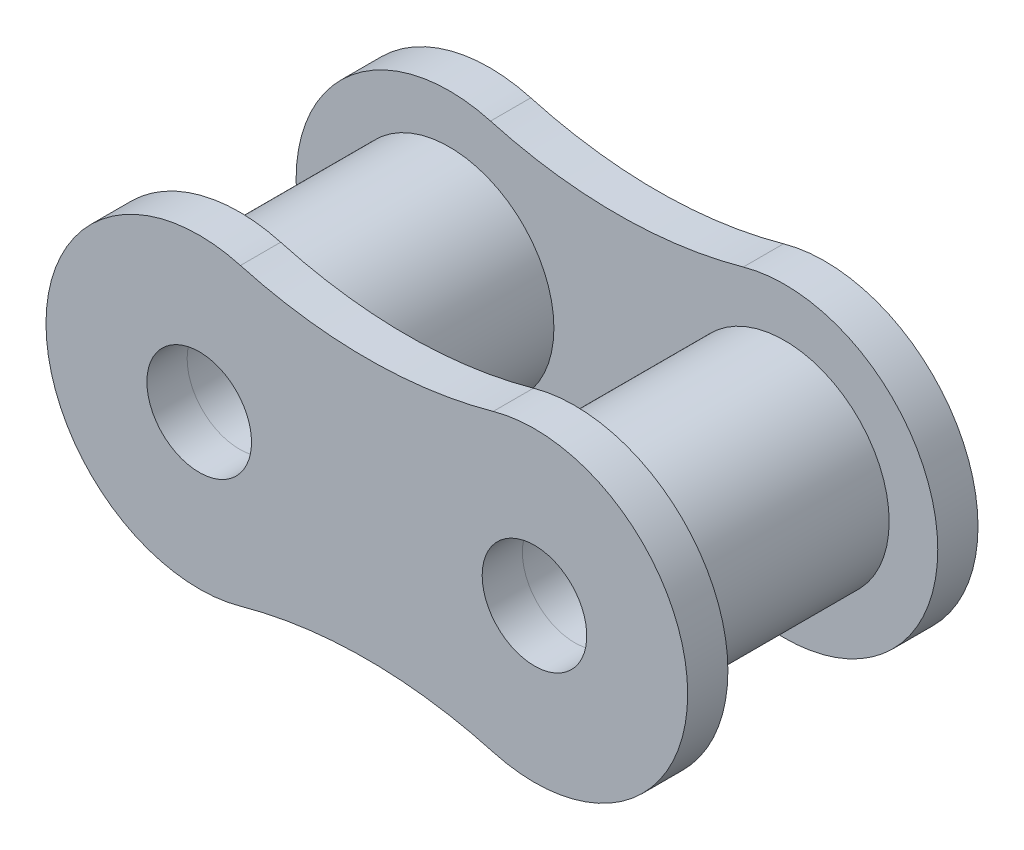
ISO-10303-21;
HEADER;
FILE_DESCRIPTION(('STEP AP214'),'2;1');
FILE_NAME('part.step','',(''),(''),'','','');
FILE_SCHEMA(('AUTOMOTIVE_DESIGN { 1 0 10303 214 1 1 1 1 }'));
ENDSEC;
DATA;
#1=APPLICATION_CONTEXT('core data for automotive mechanical design processes');
#2=APPLICATION_PROTOCOL_DEFINITION('international standard','automotive_design',2000,#1);
#3=PRODUCT_CONTEXT('',#1,'mechanical');
#4=PRODUCT('Part','Part','',(#3));
#5=PRODUCT_RELATED_PRODUCT_CATEGORY('part','',(#4));
#6=PRODUCT_DEFINITION_FORMATION('','',#4);
#7=PRODUCT_DEFINITION_CONTEXT('part definition',#1,'design');
#8=PRODUCT_DEFINITION('design','',#6,#7);
#9=PRODUCT_DEFINITION_SHAPE('','',#8);
#10=(LENGTH_UNIT() NAMED_UNIT(*) SI_UNIT(.MILLI.,.METRE.));
#11=(NAMED_UNIT(*) PLANE_ANGLE_UNIT() SI_UNIT($,.RADIAN.));
#12=(NAMED_UNIT(*) SI_UNIT($,.STERADIAN.) SOLID_ANGLE_UNIT());
#13=UNCERTAINTY_MEASURE_WITH_UNIT(LENGTH_MEASURE(1.E-05),#10,'distance_accuracy_value','');
#14=(GEOMETRIC_REPRESENTATION_CONTEXT(3) GLOBAL_UNCERTAINTY_ASSIGNED_CONTEXT((#13)) GLOBAL_UNIT_ASSIGNED_CONTEXT((#10,
#11,#12)) REPRESENTATION_CONTEXT('',''));
#15=CARTESIAN_POINT('',(0.,0.,0.));
#16=DIRECTION('',(0.,0.,1.));
#17=DIRECTION('',(1.,0.,0.));
#18=AXIS2_PLACEMENT_3D('',#15,#16,#17);
#19=CARTESIAN_POINT('',(3.175,11.3614930643691,5.4991));
#20=DIRECTION('',(0.,0.,1.));
#21=DIRECTION('',(1.,0.,0.));
#22=AXIS2_PLACEMENT_3D('',#19,#20,#21);
#23=PLANE('',#22);
#24=CARTESIAN_POINT('',(0.,-22.7229861287381,5.4991));
#25=DIRECTION('',(0.,0.,-1.));
#26=DIRECTION('',(-1.,0.,0.));
#27=AXIS2_PLACEMENT_3D('',#24,#25,#26);
#28=CIRCLE('',#27,17.7896711287381);
#29=CARTESIAN_POINT('',(-4.78793189259471,-5.58974046247473,5.4991));
#30=VERTEX_POINT('',#29);
#31=CARTESIAN_POINT('',(4.78793189259474,-5.58974046247474,5.4991));
#32=VERTEX_POINT('',#31);
#33=EDGE_CURVE('E82',#30,#32,#28,.T.);
#34=ORIENTED_EDGE('',*,*,#33,.T.);
#35=CARTESIAN_POINT('',(6.35,0.,5.4991));
#36=DIRECTION('',(0.,0.,-1.));
#37=DIRECTION('',(-1.,0.,0.));
#38=AXIS2_PLACEMENT_3D('',#35,#36,#37);
#39=CIRCLE('',#38,5.8039);
#40=CARTESIAN_POINT('',(4.78793189259472,5.58974046247474,5.4991));
#41=VERTEX_POINT('',#40);
#42=EDGE_CURVE('E103',#41,#32,#39,.T.);
#43=ORIENTED_EDGE('',*,*,#42,.F.);
#44=CARTESIAN_POINT('',(0.,22.7229861287381,5.4991));
#45=DIRECTION('',(0.,0.,-1.));
#46=DIRECTION('',(-1.,0.,0.));
#47=AXIS2_PLACEMENT_3D('',#44,#45,#46);
#48=CIRCLE('',#47,17.7896711287381);
#49=CARTESIAN_POINT('',(-4.78793189259462,5.58974046247471,5.4991));
#50=VERTEX_POINT('',#49);
#51=EDGE_CURVE('E85',#41,#50,#48,.T.);
#52=ORIENTED_EDGE('',*,*,#51,.T.);
#53=CARTESIAN_POINT('',(-6.35,0.,5.4991));
#54=DIRECTION('',(0.,0.,-1.));
#55=DIRECTION('',(-1.,0.,0.));
#56=AXIS2_PLACEMENT_3D('',#53,#54,#55);
#57=CIRCLE('',#56,5.8039);
#58=EDGE_CURVE('E19',#30,#50,#57,.T.);
#59=ORIENTED_EDGE('',*,*,#58,.F.);
#60=EDGE_LOOP('',(#34,#43,#52,#59));
#61=FACE_BOUND('',#60,.T.);
#62=CARTESIAN_POINT('',(-6.35,0.,5.4991));
#63=DIRECTION('',(0.,0.,-1.));
#64=DIRECTION('',(-1.,0.,0.));
#65=AXIS2_PLACEMENT_3D('',#62,#63,#64);
#66=CIRCLE('',#65,1.9812);
#67=CARTESIAN_POINT('',(-8.3312,0.,5.4991));
#68=VERTEX_POINT('',#67);
#69=EDGE_CURVE('E114',#68,#68,#66,.T.);
#70=ORIENTED_EDGE('',*,*,#69,.T.);
#71=EDGE_LOOP('',(#70));
#72=FACE_BOUND('',#71,.T.);
#73=CARTESIAN_POINT('',(6.35,0.,5.4991));
#74=DIRECTION('',(0.,0.,-1.));
#75=DIRECTION('',(-1.,0.,0.));
#76=AXIS2_PLACEMENT_3D('',#73,#74,#75);
#77=CIRCLE('',#76,1.9812);
#78=CARTESIAN_POINT('',(4.3688,0.,5.4991));
#79=VERTEX_POINT('',#78);
#80=EDGE_CURVE('E118',#79,#79,#77,.T.);
#81=ORIENTED_EDGE('',*,*,#80,.T.);
#82=EDGE_LOOP('',(#81));
#83=FACE_BOUND('',#82,.T.);
#84=ADVANCED_FACE('F16',(#61,#72,#83),#23,.T.);
#85=CARTESIAN_POINT('',(-6.35,0.,5.4991));
#86=DIRECTION('',(0.,0.,-1.));
#87=DIRECTION('',(-1.,0.,0.));
#88=AXIS2_PLACEMENT_3D('',#85,#86,#87);
#89=CYLINDRICAL_SURFACE('',#88,5.8039);
#90=CARTESIAN_POINT('',(-6.35,0.,3.9751));
#91=DIRECTION('',(0.,0.,-1.));
#92=DIRECTION('',(-1.,0.,0.));
#93=AXIS2_PLACEMENT_3D('',#90,#91,#92);
#94=CIRCLE('',#93,5.8039);
#95=CARTESIAN_POINT('',(-4.78793189259462,5.58974046247471,3.9751));
#96=VERTEX_POINT('',#95);
#97=CARTESIAN_POINT('',(-4.78793189259471,-5.58974046247473,3.9751));
#98=VERTEX_POINT('',#97);
#99=EDGE_CURVE('E93',#96,#98,#94,.F.);
#100=ORIENTED_EDGE('',*,*,#99,.T.);
#101=DIRECTION('',(0.,0.,-1.));
#102=VECTOR('',#101,1.);
#103=CARTESIAN_POINT('',(-4.78793189259471,-5.58974046247473,5.4991));
#104=LINE('',#103,#102);
#105=EDGE_CURVE('E89',#98,#30,#104,.F.);
#106=ORIENTED_EDGE('',*,*,#105,.T.);
#107=ORIENTED_EDGE('',*,*,#58,.T.);
#108=DIRECTION('',(0.,0.,-1.));
#109=VECTOR('',#108,1.);
#110=CARTESIAN_POINT('',(-4.78793189259454,5.58974046247469,5.4991));
#111=LINE('',#110,#109);
#112=EDGE_CURVE('E112',#50,#96,#111,.T.);
#113=ORIENTED_EDGE('',*,*,#112,.T.);
#114=EDGE_LOOP('',(#100,#106,#107,#113));
#115=FACE_BOUND('',#114,.T.);
#116=ADVANCED_FACE('F91',(#115),#89,.T.);
#117=CARTESIAN_POINT('',(0.,-22.7229861287381,5.4991));
#118=DIRECTION('',(0.,0.,-1.));
#119=DIRECTION('',(-1.,0.,0.));
#120=AXIS2_PLACEMENT_3D('',#117,#118,#119);
#121=CYLINDRICAL_SURFACE('',#120,17.7896711287381);
#122=DIRECTION('',(0.,0.,-1.));
#123=VECTOR('',#122,1.);
#124=CARTESIAN_POINT('',(4.78793189259476,-5.58974046247475,5.4991));
#125=LINE('',#124,#123);
#126=CARTESIAN_POINT('',(4.78793189259474,-5.58974046247474,3.9751));
#127=VERTEX_POINT('',#126);
#128=EDGE_CURVE('E100',#32,#127,#125,.T.);
#129=ORIENTED_EDGE('',*,*,#128,.F.);
#130=ORIENTED_EDGE('',*,*,#33,.F.);
#131=ORIENTED_EDGE('',*,*,#105,.F.);
#132=CARTESIAN_POINT('',(0.,-22.7229861287381,3.9751));
#133=DIRECTION('',(0.,0.,-1.));
#134=DIRECTION('',(-1.,0.,0.));
#135=AXIS2_PLACEMENT_3D('',#132,#133,#134);
#136=CIRCLE('',#135,17.7896711287381);
#137=EDGE_CURVE('E124',#98,#127,#136,.T.);
#138=ORIENTED_EDGE('',*,*,#137,.T.);
#139=EDGE_LOOP('',(#129,#130,#131,#138));
#140=FACE_BOUND('',#139,.T.);
#141=ADVANCED_FACE('F98',(#140),#121,.F.);
#142=CARTESIAN_POINT('',(6.35,0.,5.4991));
#143=DIRECTION('',(0.,0.,-1.));
#144=DIRECTION('',(-1.,0.,0.));
#145=AXIS2_PLACEMENT_3D('',#142,#143,#144);
#146=CYLINDRICAL_SURFACE('',#145,5.8039);
#147=ORIENTED_EDGE('',*,*,#42,.T.);
#148=ORIENTED_EDGE('',*,*,#128,.T.);
#149=CARTESIAN_POINT('',(6.35,0.,3.9751));
#150=DIRECTION('',(0.,0.,-1.));
#151=DIRECTION('',(-1.,0.,0.));
#152=AXIS2_PLACEMENT_3D('',#149,#150,#151);
#153=CIRCLE('',#152,5.8039);
#154=CARTESIAN_POINT('',(4.78793189259472,5.58974046247474,3.9751));
#155=VERTEX_POINT('',#154);
#156=EDGE_CURVE('E127',#127,#155,#153,.F.);
#157=ORIENTED_EDGE('',*,*,#156,.T.);
#158=DIRECTION('',(0.,0.,-1.));
#159=VECTOR('',#158,1.);
#160=CARTESIAN_POINT('',(4.78793189259472,5.58974046247474,5.4991));
#161=LINE('',#160,#159);
#162=EDGE_CURVE('E113',#155,#41,#161,.F.);
#163=ORIENTED_EDGE('',*,*,#162,.T.);
#164=EDGE_LOOP('',(#147,#148,#157,#163));
#165=FACE_BOUND('',#164,.T.);
#166=ADVANCED_FACE('F452',(#165),#146,.T.);
#167=CARTESIAN_POINT('',(0.,22.7229861287381,5.4991));
#168=DIRECTION('',(0.,0.,-1.));
#169=DIRECTION('',(-1.,0.,0.));
#170=AXIS2_PLACEMENT_3D('',#167,#168,#169);
#171=CYLINDRICAL_SURFACE('',#170,17.7896711287381);
#172=ORIENTED_EDGE('',*,*,#112,.F.);
#173=ORIENTED_EDGE('',*,*,#51,.F.);
#174=ORIENTED_EDGE('',*,*,#162,.F.);
#175=CARTESIAN_POINT('',(0.,22.7229861287381,3.9751));
#176=DIRECTION('',(0.,0.,-1.));
#177=DIRECTION('',(-1.,0.,0.));
#178=AXIS2_PLACEMENT_3D('',#175,#176,#177);
#179=CIRCLE('',#178,17.7896711287381);
#180=EDGE_CURVE('E130',#155,#96,#179,.T.);
#181=ORIENTED_EDGE('',*,*,#180,.T.);
#182=EDGE_LOOP('',(#172,#173,#174,#181));
#183=FACE_BOUND('',#182,.T.);
#184=ADVANCED_FACE('F442',(#183),#171,.F.);
#185=CARTESIAN_POINT('',(-6.35,0.,5.4991));
#186=DIRECTION('',(0.,0.,-1.));
#187=DIRECTION('',(-1.,0.,0.));
#188=AXIS2_PLACEMENT_3D('',#185,#186,#187);
#189=CYLINDRICAL_SURFACE('',#188,1.9812);
#190=ORIENTED_EDGE('',*,*,#69,.F.);
#191=EDGE_LOOP('',(#190));
#192=FACE_BOUND('',#191,.T.);
#193=CARTESIAN_POINT('',(-6.35,0.,3.9751));
#194=DIRECTION('',(0.,0.,-1.));
#195=DIRECTION('',(-1.,0.,0.));
#196=AXIS2_PLACEMENT_3D('',#193,#194,#195);
#197=CIRCLE('',#196,1.9812);
#198=CARTESIAN_POINT('',(-8.3312,0.,3.9751));
#199=VERTEX_POINT('',#198);
#200=EDGE_CURVE('E134',#199,#199,#197,.T.);
#201=ORIENTED_EDGE('',*,*,#200,.T.);
#202=EDGE_LOOP('',(#201));
#203=FACE_BOUND('',#202,.T.);
#204=ADVANCED_FACE('F432',(#192,#203),#189,.F.);
#205=CARTESIAN_POINT('',(6.35,0.,8.2042));
#206=DIRECTION('',(0.,0.,-1.));
#207=DIRECTION('',(-1.,0.,0.));
#208=AXIS2_PLACEMENT_3D('',#205,#206,#207);
#209=CYLINDRICAL_SURFACE('',#208,1.9812);
#210=ORIENTED_EDGE('',*,*,#80,.F.);
#211=EDGE_LOOP('',(#210));
#212=FACE_BOUND('',#211,.T.);
#213=CARTESIAN_POINT('',(6.35,0.,3.9751));
#214=DIRECTION('',(0.,0.,-1.));
#215=DIRECTION('',(-1.,0.,0.));
#216=AXIS2_PLACEMENT_3D('',#213,#214,#215);
#217=CIRCLE('',#216,1.9812);
#218=CARTESIAN_POINT('',(4.3688,0.,3.9751));
#219=VERTEX_POINT('',#218);
#220=EDGE_CURVE('E138',#219,#219,#217,.T.);
#221=ORIENTED_EDGE('',*,*,#220,.T.);
#222=EDGE_LOOP('',(#221));
#223=FACE_BOUND('',#222,.T.);
#224=ADVANCED_FACE('F422',(#212,#223),#209,.F.);
#225=CARTESIAN_POINT('',(3.175,11.3614930643691,3.9751));
#226=DIRECTION('',(0.,0.,1.));
#227=DIRECTION('',(1.,0.,0.));
#228=AXIS2_PLACEMENT_3D('',#225,#226,#227);
#229=PLANE('',#228);
#230=CARTESIAN_POINT('',(6.35,0.,3.9751));
#231=DIRECTION('',(0.,0.,-1.));
#232=DIRECTION('',(-1.,0.,0.));
#233=AXIS2_PLACEMENT_3D('',#230,#231,#232);
#234=CIRCLE('',#233,3.9624);
#235=CARTESIAN_POINT('',(2.3876,0.,3.9751));
#236=VERTEX_POINT('',#235);
#237=EDGE_CURVE('E145',#236,#236,#234,.T.);
#238=ORIENTED_EDGE('',*,*,#237,.F.);
#239=EDGE_LOOP('',(#238));
#240=FACE_BOUND('',#239,.T.);
#241=CARTESIAN_POINT('',(-6.35,0.,3.9751));
#242=DIRECTION('',(0.,0.,-1.));
#243=DIRECTION('',(-1.,0.,0.));
#244=AXIS2_PLACEMENT_3D('',#241,#242,#243);
#245=CIRCLE('',#244,3.9624);
#246=CARTESIAN_POINT('',(-10.3124,0.,3.9751));
#247=VERTEX_POINT('',#246);
#248=EDGE_CURVE('E141',#247,#247,#245,.T.);
#249=ORIENTED_EDGE('',*,*,#248,.F.);
#250=EDGE_LOOP('',(#249));
#251=FACE_BOUND('',#250,.T.);
#252=ORIENTED_EDGE('',*,*,#156,.F.);
#253=ORIENTED_EDGE('',*,*,#137,.F.);
#254=ORIENTED_EDGE('',*,*,#99,.F.);
#255=ORIENTED_EDGE('',*,*,#180,.F.);
#256=EDGE_LOOP('',(#252,#253,#254,#255));
#257=FACE_BOUND('',#256,.T.);
#258=ADVANCED_FACE('F412',(#240,#251,#257),#229,.F.);
#259=CARTESIAN_POINT('',(3.175,11.3614930643691,3.9751));
#260=DIRECTION('',(0.,0.,1.));
#261=DIRECTION('',(1.,0.,0.));
#262=AXIS2_PLACEMENT_3D('',#259,#260,#261);
#263=PLANE('',#262);
#264=ORIENTED_EDGE('',*,*,#200,.F.);
#265=EDGE_LOOP('',(#264));
#266=FACE_BOUND('',#265,.T.);
#267=CARTESIAN_POINT('',(-6.35,0.,3.9751));
#268=DIRECTION('',(0.,0.,-1.));
#269=DIRECTION('',(-1.,0.,0.));
#270=AXIS2_PLACEMENT_3D('',#267,#268,#269);
#271=CIRCLE('',#270,2.0066);
#272=CARTESIAN_POINT('',(-8.3566,0.,3.9751));
#273=VERTEX_POINT('',#272);
#274=EDGE_CURVE('E149',#273,#273,#271,.T.);
#275=ORIENTED_EDGE('',*,*,#274,.T.);
#276=EDGE_LOOP('',(#275));
#277=FACE_BOUND('',#276,.T.);
#278=ADVANCED_FACE('F402',(#266,#277),#263,.F.);
#279=CARTESIAN_POINT('',(3.175,11.3614930643691,3.9751));
#280=DIRECTION('',(0.,0.,1.));
#281=DIRECTION('',(1.,0.,0.));
#282=AXIS2_PLACEMENT_3D('',#279,#280,#281);
#283=PLANE('',#282);
#284=ORIENTED_EDGE('',*,*,#220,.F.);
#285=EDGE_LOOP('',(#284));
#286=FACE_BOUND('',#285,.T.);
#287=CARTESIAN_POINT('',(6.35,0.,3.9751));
#288=DIRECTION('',(0.,0.,-1.));
#289=DIRECTION('',(-1.,0.,0.));
#290=AXIS2_PLACEMENT_3D('',#287,#288,#289);
#291=CIRCLE('',#290,2.0066);
#292=CARTESIAN_POINT('',(4.3434,0.,3.9751));
#293=VERTEX_POINT('',#292);
#294=EDGE_CURVE('E153',#293,#293,#291,.T.);
#295=ORIENTED_EDGE('',*,*,#294,.T.);
#296=EDGE_LOOP('',(#295));
#297=FACE_BOUND('',#296,.T.);
#298=ADVANCED_FACE('F392',(#286,#297),#283,.F.);
#299=CARTESIAN_POINT('',(-6.35,0.,3.9751));
#300=DIRECTION('',(0.,0.,-1.));
#301=DIRECTION('',(-1.,0.,0.));
#302=AXIS2_PLACEMENT_3D('',#299,#300,#301);
#303=CYLINDRICAL_SURFACE('',#302,3.9624);
#304=CARTESIAN_POINT('',(-6.35,0.,-3.9751));
#305=DIRECTION('',(0.,0.,-1.));
#306=DIRECTION('',(-1.,0.,0.));
#307=AXIS2_PLACEMENT_3D('',#304,#305,#306);
#308=CIRCLE('',#307,3.9624);
#309=CARTESIAN_POINT('',(-10.3124,0.,-3.9751));
#310=VERTEX_POINT('',#309);
#311=EDGE_CURVE('E157',#310,#310,#308,.F.);
#312=ORIENTED_EDGE('',*,*,#311,.T.);
#313=EDGE_LOOP('',(#312));
#314=FACE_BOUND('',#313,.T.);
#315=ORIENTED_EDGE('',*,*,#248,.T.);
#316=EDGE_LOOP('',(#315));
#317=FACE_BOUND('',#316,.T.);
#318=ADVANCED_FACE('F382',(#314,#317),#303,.T.);
#319=CARTESIAN_POINT('',(6.35,0.,3.9751));
#320=DIRECTION('',(0.,0.,-1.));
#321=DIRECTION('',(-1.,0.,0.));
#322=AXIS2_PLACEMENT_3D('',#319,#320,#321);
#323=CYLINDRICAL_SURFACE('',#322,3.9624);
#324=ORIENTED_EDGE('',*,*,#237,.T.);
#325=EDGE_LOOP('',(#324));
#326=FACE_BOUND('',#325,.T.);
#327=CARTESIAN_POINT('',(6.35,0.,-3.9751));
#328=DIRECTION('',(0.,0.,-1.));
#329=DIRECTION('',(-1.,0.,0.));
#330=AXIS2_PLACEMENT_3D('',#327,#328,#329);
#331=CIRCLE('',#330,3.9624);
#332=CARTESIAN_POINT('',(2.3876,0.,-3.9751));
#333=VERTEX_POINT('',#332);
#334=EDGE_CURVE('E161',#333,#333,#331,.F.);
#335=ORIENTED_EDGE('',*,*,#334,.T.);
#336=EDGE_LOOP('',(#335));
#337=FACE_BOUND('',#336,.T.);
#338=ADVANCED_FACE('F372',(#326,#337),#323,.T.);
#339=CARTESIAN_POINT('',(-6.35,0.,3.9751));
#340=DIRECTION('',(0.,0.,-1.));
#341=DIRECTION('',(-1.,0.,0.));
#342=AXIS2_PLACEMENT_3D('',#339,#340,#341);
#343=CYLINDRICAL_SURFACE('',#342,2.0066);
#344=ORIENTED_EDGE('',*,*,#274,.F.);
#345=EDGE_LOOP('',(#344));
#346=FACE_BOUND('',#345,.T.);
#347=CARTESIAN_POINT('',(-6.35,0.,-3.9751));
#348=DIRECTION('',(0.,0.,-1.));
#349=DIRECTION('',(-1.,0.,0.));
#350=AXIS2_PLACEMENT_3D('',#347,#348,#349);
#351=CIRCLE('',#350,2.0066);
#352=CARTESIAN_POINT('',(-8.3566,0.,-3.9751));
#353=VERTEX_POINT('',#352);
#354=EDGE_CURVE('E165',#353,#353,#351,.T.);
#355=ORIENTED_EDGE('',*,*,#354,.T.);
#356=EDGE_LOOP('',(#355));
#357=FACE_BOUND('',#356,.T.);
#358=ADVANCED_FACE('F362',(#346,#357),#343,.F.);
#359=CARTESIAN_POINT('',(6.35,0.,3.9751));
#360=DIRECTION('',(0.,0.,-1.));
#361=DIRECTION('',(-1.,0.,0.));
#362=AXIS2_PLACEMENT_3D('',#359,#360,#361);
#363=CYLINDRICAL_SURFACE('',#362,2.0066);
#364=ORIENTED_EDGE('',*,*,#294,.F.);
#365=EDGE_LOOP('',(#364));
#366=FACE_BOUND('',#365,.T.);
#367=CARTESIAN_POINT('',(6.35,0.,-3.9751));
#368=DIRECTION('',(0.,0.,-1.));
#369=DIRECTION('',(-1.,0.,0.));
#370=AXIS2_PLACEMENT_3D('',#367,#368,#369);
#371=CIRCLE('',#370,2.0066);
#372=CARTESIAN_POINT('',(4.3434,0.,-3.9751));
#373=VERTEX_POINT('',#372);
#374=EDGE_CURVE('E169',#373,#373,#371,.T.);
#375=ORIENTED_EDGE('',*,*,#374,.T.);
#376=EDGE_LOOP('',(#375));
#377=FACE_BOUND('',#376,.T.);
#378=ADVANCED_FACE('F352',(#366,#377),#363,.F.);
#379=CARTESIAN_POINT('',(3.175,11.3614930643691,-3.9751));
#380=DIRECTION('',(0.,0.,-1.));
#381=DIRECTION('',(-1.,0.,0.));
#382=AXIS2_PLACEMENT_3D('',#379,#380,#381);
#383=PLANE('',#382);
#384=ORIENTED_EDGE('',*,*,#334,.F.);
#385=EDGE_LOOP('',(#384));
#386=FACE_BOUND('',#385,.T.);
#387=ORIENTED_EDGE('',*,*,#311,.F.);
#388=EDGE_LOOP('',(#387));
#389=FACE_BOUND('',#388,.T.);
#390=CARTESIAN_POINT('',(-6.35,0.,-3.9751));
#391=DIRECTION('',(0.,0.,1.));
#392=DIRECTION('',(1.,0.,0.));
#393=AXIS2_PLACEMENT_3D('',#390,#391,#392);
#394=CIRCLE('',#393,5.8039);
#395=CARTESIAN_POINT('',(-4.78793189259471,-5.58974046247473,-3.9751));
#396=VERTEX_POINT('',#395);
#397=CARTESIAN_POINT('',(-4.78793189259472,5.58974046247474,-3.9751));
#398=VERTEX_POINT('',#397);
#399=EDGE_CURVE('E185',#396,#398,#394,.F.);
#400=ORIENTED_EDGE('',*,*,#399,.F.);
#401=CARTESIAN_POINT('',(0.,-22.7229861287381,-3.9751));
#402=DIRECTION('',(0.,0.,1.));
#403=DIRECTION('',(1.,0.,0.));
#404=AXIS2_PLACEMENT_3D('',#401,#402,#403);
#405=CIRCLE('',#404,17.7896711287381);
#406=CARTESIAN_POINT('',(4.78793189259473,-5.58974046247474,-3.9751));
#407=VERTEX_POINT('',#406);
#408=EDGE_CURVE('E180',#396,#407,#405,.F.);
#409=ORIENTED_EDGE('',*,*,#408,.T.);
#410=CARTESIAN_POINT('',(6.35,0.,-3.9751));
#411=DIRECTION('',(0.,0.,1.));
#412=DIRECTION('',(1.,0.,0.));
#413=AXIS2_PLACEMENT_3D('',#410,#411,#412);
#414=CIRCLE('',#413,5.8039);
#415=CARTESIAN_POINT('',(4.78793189259471,5.58974046247473,-3.9751));
#416=VERTEX_POINT('',#415);
#417=EDGE_CURVE('E176',#416,#407,#414,.F.);
#418=ORIENTED_EDGE('',*,*,#417,.F.);
#419=CARTESIAN_POINT('',(0.,22.7229861287381,-3.9751));
#420=DIRECTION('',(0.,0.,1.));
#421=DIRECTION('',(1.,0.,0.));
#422=AXIS2_PLACEMENT_3D('',#419,#420,#421);
#423=CIRCLE('',#422,17.7896711287381);
#424=EDGE_CURVE('E173',#416,#398,#423,.F.);
#425=ORIENTED_EDGE('',*,*,#424,.T.);
#426=EDGE_LOOP('',(#400,#409,#418,#425));
#427=FACE_BOUND('',#426,.T.);
#428=ADVANCED_FACE('F246',(#386,#389,#427),#383,.F.);
#429=CARTESIAN_POINT('',(3.175,11.3614930643691,-3.9751));
#430=DIRECTION('',(0.,0.,-1.));
#431=DIRECTION('',(-1.,0.,0.));
#432=AXIS2_PLACEMENT_3D('',#429,#430,#431);
#433=PLANE('',#432);
#434=CARTESIAN_POINT('',(-6.35,0.,-3.9751));
#435=DIRECTION('',(0.,0.,1.));
#436=DIRECTION('',(1.,0.,0.));
#437=AXIS2_PLACEMENT_3D('',#434,#435,#436);
#438=CIRCLE('',#437,1.9812);
#439=CARTESIAN_POINT('',(-4.3688,0.,-3.9751));
#440=VERTEX_POINT('',#439);
#441=EDGE_CURVE('E190',#440,#440,#438,.F.);
#442=ORIENTED_EDGE('',*,*,#441,.T.);
#443=EDGE_LOOP('',(#442));
#444=FACE_BOUND('',#443,.T.);
#445=ORIENTED_EDGE('',*,*,#354,.F.);
#446=EDGE_LOOP('',(#445));
#447=FACE_BOUND('',#446,.T.);
#448=ADVANCED_FACE('F256',(#444,#447),#433,.F.);
#449=CARTESIAN_POINT('',(3.175,11.3614930643691,-3.9751));
#450=DIRECTION('',(0.,0.,-1.));
#451=DIRECTION('',(-1.,0.,0.));
#452=AXIS2_PLACEMENT_3D('',#449,#450,#451);
#453=PLANE('',#452);
#454=CARTESIAN_POINT('',(6.35,0.,-3.9751));
#455=DIRECTION('',(0.,0.,-1.));
#456=DIRECTION('',(-1.,0.,0.));
#457=AXIS2_PLACEMENT_3D('',#454,#455,#456);
#458=CIRCLE('',#457,1.9812);
#459=CARTESIAN_POINT('',(4.3688,0.,-3.9751));
#460=VERTEX_POINT('',#459);
#461=EDGE_CURVE('E194',#460,#460,#458,.T.);
#462=ORIENTED_EDGE('',*,*,#461,.T.);
#463=EDGE_LOOP('',(#462));
#464=FACE_BOUND('',#463,.T.);
#465=ORIENTED_EDGE('',*,*,#374,.F.);
#466=EDGE_LOOP('',(#465));
#467=FACE_BOUND('',#466,.T.);
#468=ADVANCED_FACE('F249',(#464,#467),#453,.F.);
#469=CARTESIAN_POINT('',(0.,22.7229861287381,-5.4991));
#470=DIRECTION('',(0.,0.,1.));
#471=DIRECTION('',(1.,0.,0.));
#472=AXIS2_PLACEMENT_3D('',#469,#470,#471);
#473=CYLINDRICAL_SURFACE('',#472,17.7896711287381);
#474=DIRECTION('',(0.,0.,1.));
#475=VECTOR('',#474,1.);
#476=CARTESIAN_POINT('',(4.78793189259471,5.58974046247473,-5.4991));
#477=LINE('',#476,#475);
#478=CARTESIAN_POINT('',(4.78793189259471,5.58974046247473,-5.4991));
#479=VERTEX_POINT('',#478);
#480=EDGE_CURVE('E179',#479,#416,#477,.T.);
#481=ORIENTED_EDGE('',*,*,#480,.F.);
#482=CARTESIAN_POINT('',(0.,22.7229861287381,-5.4991));
#483=DIRECTION('',(0.,0.,1.));
#484=DIRECTION('',(1.,0.,0.));
#485=AXIS2_PLACEMENT_3D('',#482,#483,#484);
#486=CIRCLE('',#485,17.7896711287381);
#487=CARTESIAN_POINT('',(-4.78793189259472,5.58974046247474,-5.4991));
#488=VERTEX_POINT('',#487);
#489=EDGE_CURVE('E198',#488,#479,#486,.T.);
#490=ORIENTED_EDGE('',*,*,#489,.F.);
#491=DIRECTION('',(0.,0.,1.));
#492=VECTOR('',#491,1.);
#493=CARTESIAN_POINT('',(-4.78793189259472,5.58974046247474,-5.4991));
#494=LINE('',#493,#492);
#495=EDGE_CURVE('E189',#398,#488,#494,.F.);
#496=ORIENTED_EDGE('',*,*,#495,.F.);
#497=ORIENTED_EDGE('',*,*,#424,.F.);
#498=EDGE_LOOP('',(#481,#490,#496,#497));
#499=FACE_BOUND('',#498,.T.);
#500=ADVANCED_FACE('F247',(#499),#473,.F.);
#501=CARTESIAN_POINT('',(6.35,0.,-5.4991));
#502=DIRECTION('',(0.,0.,1.));
#503=DIRECTION('',(1.,0.,0.));
#504=AXIS2_PLACEMENT_3D('',#501,#502,#503);
#505=CYLINDRICAL_SURFACE('',#504,5.8039);
#506=CARTESIAN_POINT('',(6.35,0.,-5.4991));
#507=DIRECTION('',(0.,0.,1.));
#508=DIRECTION('',(1.,0.,0.));
#509=AXIS2_PLACEMENT_3D('',#506,#507,#508);
#510=CIRCLE('',#509,5.8039);
#511=CARTESIAN_POINT('',(4.78793189259473,-5.58974046247475,-5.4991));
#512=VERTEX_POINT('',#511);
#513=EDGE_CURVE('E202',#479,#512,#510,.F.);
#514=ORIENTED_EDGE('',*,*,#513,.F.);
#515=ORIENTED_EDGE('',*,*,#480,.T.);
#516=ORIENTED_EDGE('',*,*,#417,.T.);
#517=DIRECTION('',(0.,0.,1.));
#518=VECTOR('',#517,1.);
#519=CARTESIAN_POINT('',(4.78793189259476,-5.58974046247475,-5.4991));
#520=LINE('',#519,#518);
#521=EDGE_CURVE('E184',#407,#512,#520,.F.);
#522=ORIENTED_EDGE('',*,*,#521,.T.);
#523=EDGE_LOOP('',(#514,#515,#516,#522));
#524=FACE_BOUND('',#523,.T.);
#525=ADVANCED_FACE('F244',(#524),#505,.T.);
#526=CARTESIAN_POINT('',(0.,-22.7229861287381,-5.4991));
#527=DIRECTION('',(0.,0.,1.));
#528=DIRECTION('',(1.,0.,0.));
#529=AXIS2_PLACEMENT_3D('',#526,#527,#528);
#530=CYLINDRICAL_SURFACE('',#529,17.7896711287381);
#531=DIRECTION('',(0.,0.,1.));
#532=VECTOR('',#531,1.);
#533=CARTESIAN_POINT('',(-4.78793189259471,-5.58974046247473,-5.4991));
#534=LINE('',#533,#532);
#535=CARTESIAN_POINT('',(-4.78793189259471,-5.58974046247473,-5.4991));
#536=VERTEX_POINT('',#535);
#537=EDGE_CURVE('E35',#536,#396,#534,.T.);
#538=ORIENTED_EDGE('',*,*,#537,.F.);
#539=CARTESIAN_POINT('',(0.,-22.7229861287381,-5.4991));
#540=DIRECTION('',(0.,0.,1.));
#541=DIRECTION('',(1.,0.,0.));
#542=AXIS2_PLACEMENT_3D('',#539,#540,#541);
#543=CIRCLE('',#542,17.7896711287381);
#544=EDGE_CURVE('E206',#512,#536,#543,.T.);
#545=ORIENTED_EDGE('',*,*,#544,.F.);
#546=ORIENTED_EDGE('',*,*,#521,.F.);
#547=ORIENTED_EDGE('',*,*,#408,.F.);
#548=EDGE_LOOP('',(#538,#545,#546,#547));
#549=FACE_BOUND('',#548,.T.);
#550=ADVANCED_FACE('F242',(#549),#530,.F.);
#551=CARTESIAN_POINT('',(-6.35,0.,-5.4991));
#552=DIRECTION('',(0.,0.,1.));
#553=DIRECTION('',(1.,0.,0.));
#554=AXIS2_PLACEMENT_3D('',#551,#552,#553);
#555=CYLINDRICAL_SURFACE('',#554,5.8039);
#556=ORIENTED_EDGE('',*,*,#399,.T.);
#557=ORIENTED_EDGE('',*,*,#495,.T.);
#558=CARTESIAN_POINT('',(-6.35,0.,-5.4991));
#559=DIRECTION('',(0.,0.,1.));
#560=DIRECTION('',(1.,0.,0.));
#561=AXIS2_PLACEMENT_3D('',#558,#559,#560);
#562=CIRCLE('',#561,5.8039);
#563=EDGE_CURVE('E210',#536,#488,#562,.F.);
#564=ORIENTED_EDGE('',*,*,#563,.F.);
#565=ORIENTED_EDGE('',*,*,#537,.T.);
#566=EDGE_LOOP('',(#556,#557,#564,#565));
#567=FACE_BOUND('',#566,.T.);
#568=ADVANCED_FACE('F234',(#567),#555,.T.);
#569=CARTESIAN_POINT('',(-6.35,0.,-5.4991));
#570=DIRECTION('',(0.,0.,1.));
#571=DIRECTION('',(1.,0.,0.));
#572=AXIS2_PLACEMENT_3D('',#569,#570,#571);
#573=CYLINDRICAL_SURFACE('',#572,1.9812);
#574=CARTESIAN_POINT('',(-6.35,0.,-5.4991));
#575=DIRECTION('',(0.,0.,1.));
#576=DIRECTION('',(1.,0.,0.));
#577=AXIS2_PLACEMENT_3D('',#574,#575,#576);
#578=CIRCLE('',#577,1.9812);
#579=CARTESIAN_POINT('',(-4.3688,0.,-5.4991));
#580=VERTEX_POINT('',#579);
#581=EDGE_CURVE('E26',#580,#580,#578,.T.);
#582=ORIENTED_EDGE('',*,*,#581,.F.);
#583=EDGE_LOOP('',(#582));
#584=FACE_BOUND('',#583,.T.);
#585=ORIENTED_EDGE('',*,*,#441,.F.);
#586=EDGE_LOOP('',(#585));
#587=FACE_BOUND('',#586,.T.);
#588=ADVANCED_FACE('F265',(#584,#587),#573,.F.);
#589=CARTESIAN_POINT('',(6.35,0.,8.2042));
#590=DIRECTION('',(0.,0.,-1.));
#591=DIRECTION('',(-1.,0.,0.));
#592=AXIS2_PLACEMENT_3D('',#589,#590,#591);
#593=CYLINDRICAL_SURFACE('',#592,1.9812);
#594=CARTESIAN_POINT('',(6.35,0.,-5.49910000000001));
#595=DIRECTION('',(0.,0.,-1.));
#596=DIRECTION('',(-1.,0.,0.));
#597=AXIS2_PLACEMENT_3D('',#594,#595,#596);
#598=CIRCLE('',#597,1.9812);
#599=CARTESIAN_POINT('',(4.3688,0.,-5.49910000000001));
#600=VERTEX_POINT('',#599);
#601=EDGE_CURVE('E11',#600,#600,#598,.F.);
#602=ORIENTED_EDGE('',*,*,#601,.F.);
#603=EDGE_LOOP('',(#602));
#604=FACE_BOUND('',#603,.T.);
#605=ORIENTED_EDGE('',*,*,#461,.F.);
#606=EDGE_LOOP('',(#605));
#607=FACE_BOUND('',#606,.T.);
#608=ADVANCED_FACE('F260',(#604,#607),#593,.F.);
#609=CARTESIAN_POINT('',(3.175,11.3614930643691,-5.4991));
#610=DIRECTION('',(0.,0.,-1.));
#611=DIRECTION('',(-1.,0.,0.));
#612=AXIS2_PLACEMENT_3D('',#609,#610,#611);
#613=PLANE('',#612);
#614=ORIENTED_EDGE('',*,*,#601,.T.);
#615=EDGE_LOOP('',(#614));
#616=FACE_BOUND('',#615,.T.);
#617=ORIENTED_EDGE('',*,*,#581,.T.);
#618=EDGE_LOOP('',(#617));
#619=FACE_BOUND('',#618,.T.);
#620=ORIENTED_EDGE('',*,*,#544,.T.);
#621=ORIENTED_EDGE('',*,*,#563,.T.);
#622=ORIENTED_EDGE('',*,*,#489,.T.);
#623=ORIENTED_EDGE('',*,*,#513,.T.);
#624=EDGE_LOOP('',(#620,#621,#622,#623));
#625=FACE_BOUND('',#624,.T.);
#626=ADVANCED_FACE('F239',(#616,#619,#625),#613,.T.);
#627=CLOSED_SHELL('',(#84,#116,#141,#166,#184,#204,#224,#258,#278,#298,#318,#338,#358,#378,#428,
#448,#468,#500,#525,#550,#568,#588,#608,#626));
#628=MANIFOLD_SOLID_BREP('B1',#627);
#629=ADVANCED_BREP_SHAPE_REPRESENTATION('',(#18,#628),#14);
#630=SHAPE_DEFINITION_REPRESENTATION(#9,#629);
ENDSEC;
END-ISO-10303-21;
